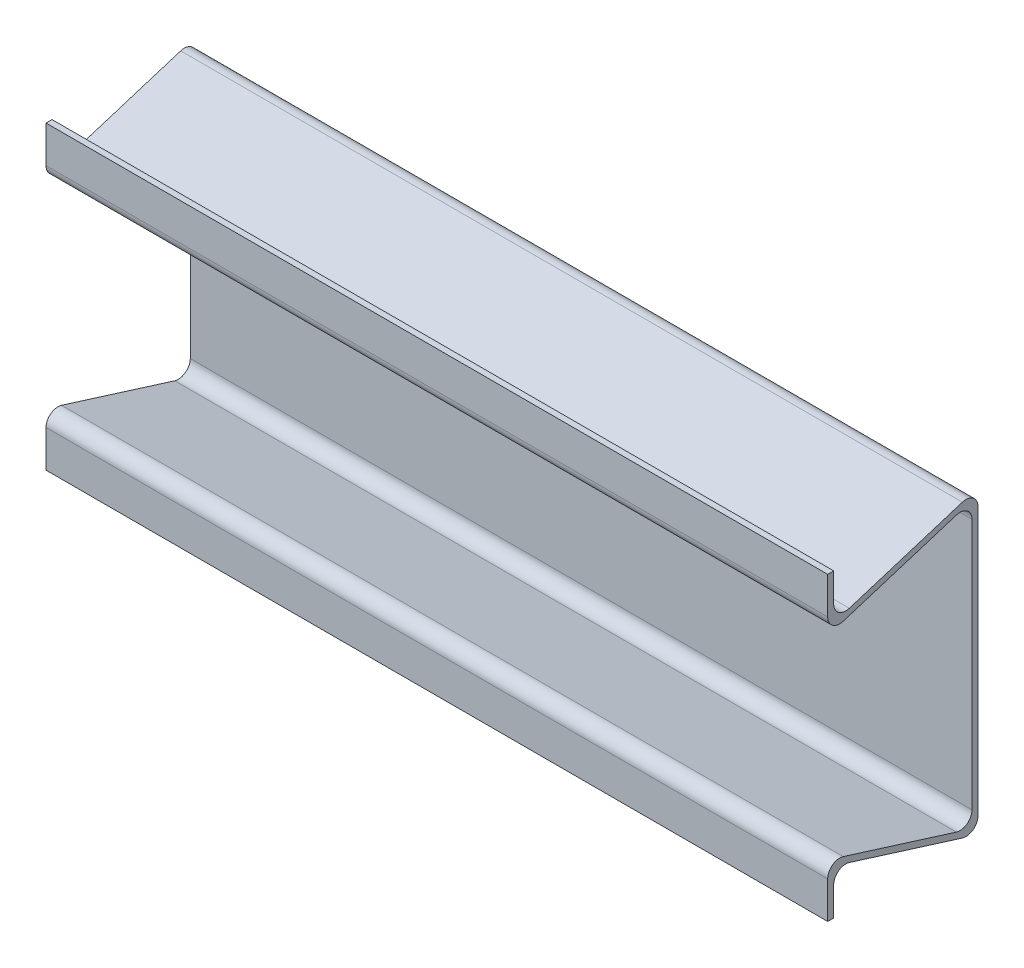
ISO-10303-21;
HEADER;
FILE_DESCRIPTION(('STEP AP214'),'2;1');
FILE_NAME('part.step','',(''),(''),'','','');
FILE_SCHEMA(('AUTOMOTIVE_DESIGN { 1 0 10303 214 1 1 1 1 }'));
ENDSEC;
DATA;
#1=APPLICATION_CONTEXT('core data for automotive mechanical design processes');
#2=APPLICATION_PROTOCOL_DEFINITION('international standard','automotive_design',2000,#1);
#3=PRODUCT_CONTEXT('',#1,'mechanical');
#4=PRODUCT('Part','Part','',(#3));
#5=PRODUCT_RELATED_PRODUCT_CATEGORY('part','',(#4));
#6=PRODUCT_DEFINITION_FORMATION('','',#4);
#7=PRODUCT_DEFINITION_CONTEXT('part definition',#1,'design');
#8=PRODUCT_DEFINITION('design','',#6,#7);
#9=PRODUCT_DEFINITION_SHAPE('','',#8);
#10=(LENGTH_UNIT() NAMED_UNIT(*) SI_UNIT(.MILLI.,.METRE.));
#11=(NAMED_UNIT(*) PLANE_ANGLE_UNIT() SI_UNIT($,.RADIAN.));
#12=(NAMED_UNIT(*) SI_UNIT($,.STERADIAN.) SOLID_ANGLE_UNIT());
#13=UNCERTAINTY_MEASURE_WITH_UNIT(LENGTH_MEASURE(1.E-05),#10,'distance_accuracy_value','');
#14=(GEOMETRIC_REPRESENTATION_CONTEXT(3) GLOBAL_UNCERTAINTY_ASSIGNED_CONTEXT((#13)) GLOBAL_UNIT_ASSIGNED_CONTEXT((#10,
#11,#12)) REPRESENTATION_CONTEXT('',''));
#15=CARTESIAN_POINT('',(0.,0.,0.));
#16=DIRECTION('',(0.,0.,1.));
#17=DIRECTION('',(1.,0.,0.));
#18=AXIS2_PLACEMENT_3D('',#15,#16,#17);
#19=CARTESIAN_POINT('',(-130.,-50.,-50.));
#20=DIRECTION('',(0.,0.,-1.));
#21=DIRECTION('',(0.,1.,0.));
#22=AXIS2_PLACEMENT_3D('',#19,#20,#21);
#23=PLANE('',#22);
#24=DIRECTION('',(0.,1.,0.));
#25=VECTOR('',#24,1.);
#26=CARTESIAN_POINT('',(130.,50.,-50.));
#27=LINE('',#26,#25);
#28=CARTESIAN_POINT('',(130.,-44.5592363464399,-50.));
#29=VERTEX_POINT('',#28);
#30=CARTESIAN_POINT('',(130.,44.55923634644,-50.));
#31=VERTEX_POINT('',#30);
#32=EDGE_CURVE('E399',#29,#31,#27,.T.);
#33=ORIENTED_EDGE('',*,*,#32,.F.);
#34=DIRECTION('',(1.,0.,0.));
#35=VECTOR('',#34,1.);
#36=CARTESIAN_POINT('',(-130.,-44.55923634644,-50.));
#37=LINE('',#36,#35);
#38=CARTESIAN_POINT('',(-130.,-44.5592363464399,-50.));
#39=VERTEX_POINT('',#38);
#40=EDGE_CURVE('E313',#29,#39,#37,.F.);
#41=ORIENTED_EDGE('',*,*,#40,.T.);
#42=DIRECTION('',(0.,1.,0.));
#43=VECTOR('',#42,1.);
#44=CARTESIAN_POINT('',(-130.,50.,-50.));
#45=LINE('',#44,#43);
#46=CARTESIAN_POINT('',(-130.,44.55923634644,-50.));
#47=VERTEX_POINT('',#46);
#48=EDGE_CURVE('E238',#39,#47,#45,.T.);
#49=ORIENTED_EDGE('',*,*,#48,.T.);
#50=DIRECTION('',(1.,0.,0.));
#51=VECTOR('',#50,1.);
#52=CARTESIAN_POINT('',(-130.,44.55923634644,-50.));
#53=LINE('',#52,#51);
#54=EDGE_CURVE('E310',#47,#31,#53,.T.);
#55=ORIENTED_EDGE('',*,*,#54,.T.);
#56=EDGE_LOOP('',(#33,#41,#49,#55));
#57=FACE_BOUND('',#56,.T.);
#58=ADVANCED_FACE('F53',(#57),#23,.T.);
#59=CARTESIAN_POINT('',(-130.,-50.,-50.));
#60=DIRECTION('',(0.,-0.95447997803503,0.298274993135947));
#61=DIRECTION('',(0.,-0.298274993135947,-0.95447997803503));
#62=AXIS2_PLACEMENT_3D('',#59,#60,#61);
#63=PLANE('',#62);
#64=DIRECTION('',(0.,-0.298274993135947,-0.95447997803503));
#65=VECTOR('',#64,1.);
#66=CARTESIAN_POINT('',(130.,-50.,-50.));
#67=LINE('',#66,#65);
#68=CARTESIAN_POINT('',(130.,-36.6228437414199,-7.19309997254378));
#69=VERTEX_POINT('',#68);
#70=CARTESIAN_POINT('',(130.,-48.3771562585801,-44.8069000274562));
#71=VERTEX_POINT('',#70);
#72=EDGE_CURVE('E235',#69,#71,#67,.T.);
#73=ORIENTED_EDGE('',*,*,#72,.F.);
#74=DIRECTION('',(1.,0.,0.));
#75=VECTOR('',#74,1.);
#76=CARTESIAN_POINT('',(-130.,-36.6228437414199,-7.19309997254379));
#77=LINE('',#76,#75);
#78=CARTESIAN_POINT('',(-130.,-36.6228437414199,-7.19309997254378));
#79=VERTEX_POINT('',#78);
#80=EDGE_CURVE('E280',#69,#79,#77,.F.);
#81=ORIENTED_EDGE('',*,*,#80,.T.);
#82=DIRECTION('',(0.,-0.298274993135947,-0.95447997803503));
#83=VECTOR('',#82,1.);
#84=CARTESIAN_POINT('',(-130.,-50.,-50.));
#85=LINE('',#84,#83);
#86=CARTESIAN_POINT('',(-130.,-48.3771562585801,-44.8069000274562));
#87=VERTEX_POINT('',#86);
#88=EDGE_CURVE('E211',#79,#87,#85,.T.);
#89=ORIENTED_EDGE('',*,*,#88,.T.);
#90=DIRECTION('',(1.,0.,0.));
#91=VECTOR('',#90,1.);
#92=CARTESIAN_POINT('',(-130.,-48.3771562585801,-44.8069000274562));
#93=LINE('',#92,#91);
#94=EDGE_CURVE('E277',#87,#71,#93,.T.);
#95=ORIENTED_EDGE('',*,*,#94,.T.);
#96=EDGE_LOOP('',(#73,#81,#89,#95));
#97=FACE_BOUND('',#96,.T.);
#98=ADVANCED_FACE('F390',(#97),#63,.T.);
#99=CARTESIAN_POINT('',(-130.,-35.,-2.));
#100=DIRECTION('',(0.,0.,-1.));
#101=DIRECTION('',(0.,1.,0.));
#102=AXIS2_PLACEMENT_3D('',#99,#100,#101);
#103=PLANE('',#102);
#104=DIRECTION('',(0.,1.,0.));
#105=VECTOR('',#104,1.);
#106=CARTESIAN_POINT('',(-130.,-35.,-2.));
#107=LINE('',#106,#105);
#108=CARTESIAN_POINT('',(-130.,-50.,-2.));
#109=VERTEX_POINT('',#108);
#110=CARTESIAN_POINT('',(-130.,-40.44076365356,-2.));
#111=VERTEX_POINT('',#110);
#112=EDGE_CURVE('E263',#109,#111,#107,.T.);
#113=ORIENTED_EDGE('',*,*,#112,.T.);
#114=DIRECTION('',(1.,0.,0.));
#115=VECTOR('',#114,1.);
#116=CARTESIAN_POINT('',(130.,-40.44076365356,-2.));
#117=LINE('',#116,#115);
#118=CARTESIAN_POINT('',(130.,-40.44076365356,-2.));
#119=VERTEX_POINT('',#118);
#120=EDGE_CURVE('E270',#111,#119,#117,.T.);
#121=ORIENTED_EDGE('',*,*,#120,.T.);
#122=DIRECTION('',(0.,1.,0.));
#123=VECTOR('',#122,1.);
#124=CARTESIAN_POINT('',(130.,-35.,-2.));
#125=LINE('',#124,#123);
#126=CARTESIAN_POINT('',(130.,-50.,-2.));
#127=VERTEX_POINT('',#126);
#128=EDGE_CURVE('E232',#127,#119,#125,.T.);
#129=ORIENTED_EDGE('',*,*,#128,.F.);
#130=DIRECTION('',(1.,0.,0.));
#131=VECTOR('',#130,1.);
#132=CARTESIAN_POINT('',(-130.,-50.,-2.));
#133=LINE('',#132,#131);
#134=EDGE_CURVE('E268',#109,#127,#133,.T.);
#135=ORIENTED_EDGE('',*,*,#134,.F.);
#136=EDGE_LOOP('',(#113,#121,#129,#135));
#137=FACE_BOUND('',#136,.T.);
#138=ADVANCED_FACE('F381',(#137),#103,.T.);
#139=CARTESIAN_POINT('',(-130.,-50.,0.));
#140=DIRECTION('',(0.,-1.,0.));
#141=DIRECTION('',(0.,0.,-1.));
#142=AXIS2_PLACEMENT_3D('',#139,#140,#141);
#143=PLANE('',#142);
#144=ORIENTED_EDGE('',*,*,#134,.T.);
#145=DIRECTION('',(0.,0.,-1.));
#146=VECTOR('',#145,1.);
#147=CARTESIAN_POINT('',(130.,-50.,0.));
#148=LINE('',#147,#146);
#149=CARTESIAN_POINT('',(130.,-50.,0.));
#150=VERTEX_POINT('',#149);
#151=EDGE_CURVE('E229',#150,#127,#148,.T.);
#152=ORIENTED_EDGE('',*,*,#151,.F.);
#153=DIRECTION('',(1.,0.,0.));
#154=VECTOR('',#153,1.);
#155=CARTESIAN_POINT('',(-130.,-50.,0.));
#156=LINE('',#155,#154);
#157=CARTESIAN_POINT('',(-130.,-50.,0.));
#158=VERTEX_POINT('',#157);
#159=EDGE_CURVE('E271',#158,#150,#156,.T.);
#160=ORIENTED_EDGE('',*,*,#159,.F.);
#161=DIRECTION('',(0.,0.,-1.));
#162=VECTOR('',#161,1.);
#163=CARTESIAN_POINT('',(-130.,-50.,0.));
#164=LINE('',#163,#162);
#165=EDGE_CURVE('E260',#158,#109,#164,.T.);
#166=ORIENTED_EDGE('',*,*,#165,.T.);
#167=EDGE_LOOP('',(#144,#152,#160,#166));
#168=FACE_BOUND('',#167,.T.);
#169=ADVANCED_FACE('F378',(#168),#143,.T.);
#170=CARTESIAN_POINT('',(-130.,-32.27961817322,0.));
#171=DIRECTION('',(0.,0.,1.));
#172=DIRECTION('',(1.,0.,0.));
#173=AXIS2_PLACEMENT_3D('',#170,#171,#172);
#174=PLANE('',#173);
#175=DIRECTION('',(0.,-1.,0.));
#176=VECTOR('',#175,1.);
#177=CARTESIAN_POINT('',(130.,-32.27961817322,0.));
#178=LINE('',#177,#176);
#179=CARTESIAN_POINT('',(130.,-37.72038182678,0.));
#180=VERTEX_POINT('',#179);
#181=EDGE_CURVE('E227',#180,#150,#178,.T.);
#182=ORIENTED_EDGE('',*,*,#181,.F.);
#183=DIRECTION('',(1.,0.,0.));
#184=VECTOR('',#183,1.);
#185=CARTESIAN_POINT('',(-130.,-37.72038182678,0.));
#186=LINE('',#185,#184);
#187=CARTESIAN_POINT('',(-130.,-37.72038182678,0.));
#188=VERTEX_POINT('',#187);
#189=EDGE_CURVE('E295',#180,#188,#186,.F.);
#190=ORIENTED_EDGE('',*,*,#189,.T.);
#191=DIRECTION('',(0.,-1.,0.));
#192=VECTOR('',#191,1.);
#193=CARTESIAN_POINT('',(-130.,-32.27961817322,0.));
#194=LINE('',#193,#192);
#195=EDGE_CURVE('E258',#188,#158,#194,.T.);
#196=ORIENTED_EDGE('',*,*,#195,.T.);
#197=ORIENTED_EDGE('',*,*,#159,.T.);
#198=EDGE_LOOP('',(#182,#190,#196,#197));
#199=FACE_BOUND('',#198,.T.);
#200=ADVANCED_FACE('F373',(#199),#174,.T.);
#201=CARTESIAN_POINT('',(-130.,-47.27961817322,-48.));
#202=DIRECTION('',(0.,0.95447997803503,-0.298274993135947));
#203=DIRECTION('',(0.,0.298274993135947,0.95447997803503));
#204=AXIS2_PLACEMENT_3D('',#201,#202,#203);
#205=PLANE('',#204);
#206=DIRECTION('',(0.,0.298274993135947,0.95447997803503));
#207=VECTOR('',#206,1.);
#208=CARTESIAN_POINT('',(-130.,-47.27961817322,-48.));
#209=LINE('',#208,#207);
#210=CARTESIAN_POINT('',(-130.,-45.6567744318,-42.8069000274562));
#211=VERTEX_POINT('',#210);
#212=CARTESIAN_POINT('',(-130.,-33.9024619146399,-5.19309997254379));
#213=VERTEX_POINT('',#212);
#214=EDGE_CURVE('E255',#211,#213,#209,.T.);
#215=ORIENTED_EDGE('',*,*,#214,.T.);
#216=DIRECTION('',(1.,0.,0.));
#217=VECTOR('',#216,1.);
#218=CARTESIAN_POINT('',(-130.,-33.9024619146399,-5.19309997254379));
#219=LINE('',#218,#217);
#220=CARTESIAN_POINT('',(130.,-33.9024619146399,-5.19309997254379));
#221=VERTEX_POINT('',#220);
#222=EDGE_CURVE('E284',#213,#221,#219,.T.);
#223=ORIENTED_EDGE('',*,*,#222,.T.);
#224=DIRECTION('',(0.,0.298274993135947,0.95447997803503));
#225=VECTOR('',#224,1.);
#226=CARTESIAN_POINT('',(130.,-47.27961817322,-48.));
#227=LINE('',#226,#225);
#228=CARTESIAN_POINT('',(130.,-45.6567744318,-42.8069000274562));
#229=VERTEX_POINT('',#228);
#230=EDGE_CURVE('E225',#229,#221,#227,.T.);
#231=ORIENTED_EDGE('',*,*,#230,.F.);
#232=DIRECTION('',(1.,0.,0.));
#233=VECTOR('',#232,1.);
#234=CARTESIAN_POINT('',(-130.,-45.6567744318,-42.8069000274562));
#235=LINE('',#234,#233);
#236=EDGE_CURVE('E282',#229,#211,#235,.F.);
#237=ORIENTED_EDGE('',*,*,#236,.T.);
#238=EDGE_LOOP('',(#215,#223,#231,#237));
#239=FACE_BOUND('',#238,.T.);
#240=ADVANCED_FACE('F364',(#239),#205,.T.);
#241=CARTESIAN_POINT('',(-130.,-47.27961817322,-48.));
#242=DIRECTION('',(0.,0.,1.));
#243=DIRECTION('',(0.,-1.,0.));
#244=AXIS2_PLACEMENT_3D('',#241,#242,#243);
#245=PLANE('',#244);
#246=DIRECTION('',(0.,-1.,0.));
#247=VECTOR('',#246,1.);
#248=CARTESIAN_POINT('',(-130.,47.27961817322,-48.));
#249=LINE('',#248,#247);
#250=CARTESIAN_POINT('',(-130.,41.8388545196599,-48.));
#251=VERTEX_POINT('',#250);
#252=CARTESIAN_POINT('',(-130.,-41.8388545196599,-48.));
#253=VERTEX_POINT('',#252);
#254=EDGE_CURVE('E252',#251,#253,#249,.T.);
#255=ORIENTED_EDGE('',*,*,#254,.T.);
#256=DIRECTION('',(1.,0.,0.));
#257=VECTOR('',#256,1.);
#258=CARTESIAN_POINT('',(130.,-41.8388545196599,-48.));
#259=LINE('',#258,#257);
#260=CARTESIAN_POINT('',(130.,-41.8388545196599,-48.));
#261=VERTEX_POINT('',#260);
#262=EDGE_CURVE('E307',#253,#261,#259,.T.);
#263=ORIENTED_EDGE('',*,*,#262,.T.);
#264=DIRECTION('',(0.,-1.,0.));
#265=VECTOR('',#264,1.);
#266=CARTESIAN_POINT('',(130.,47.27961817322,-48.));
#267=LINE('',#266,#265);
#268=CARTESIAN_POINT('',(130.,41.8388545196599,-48.));
#269=VERTEX_POINT('',#268);
#270=EDGE_CURVE('E222',#269,#261,#267,.T.);
#271=ORIENTED_EDGE('',*,*,#270,.F.);
#272=DIRECTION('',(1.,0.,0.));
#273=VECTOR('',#272,1.);
#274=CARTESIAN_POINT('',(-130.,41.8388545196599,-48.));
#275=LINE('',#274,#273);
#276=EDGE_CURVE('E305',#269,#251,#275,.F.);
#277=ORIENTED_EDGE('',*,*,#276,.T.);
#278=EDGE_LOOP('',(#255,#263,#271,#277));
#279=FACE_BOUND('',#278,.T.);
#280=ADVANCED_FACE('F356',(#279),#245,.T.);
#281=CARTESIAN_POINT('',(-130.,47.27961817322,-48.));
#282=DIRECTION('',(0.,-0.95447997803503,-0.298274993135947));
#283=DIRECTION('',(0.,0.298274993135947,-0.95447997803503));
#284=AXIS2_PLACEMENT_3D('',#281,#282,#283);
#285=PLANE('',#284);
#286=DIRECTION('',(0.,0.298274993135947,-0.95447997803503));
#287=VECTOR('',#286,1.);
#288=CARTESIAN_POINT('',(-130.,47.27961817322,-48.));
#289=LINE('',#288,#287);
#290=CARTESIAN_POINT('',(-130.,33.9024619146399,-5.19309997254379));
#291=VERTEX_POINT('',#290);
#292=CARTESIAN_POINT('',(-130.,45.6567744318001,-42.8069000274562));
#293=VERTEX_POINT('',#292);
#294=EDGE_CURVE('E249',#291,#293,#289,.T.);
#295=ORIENTED_EDGE('',*,*,#294,.T.);
#296=DIRECTION('',(1.,0.,0.));
#297=VECTOR('',#296,1.);
#298=CARTESIAN_POINT('',(130.,45.6567744318001,-42.8069000274562));
#299=LINE('',#298,#297);
#300=CARTESIAN_POINT('',(130.,45.6567744318001,-42.8069000274562));
#301=VERTEX_POINT('',#300);
#302=EDGE_CURVE('E321',#293,#301,#299,.T.);
#303=ORIENTED_EDGE('',*,*,#302,.T.);
#304=DIRECTION('',(0.,0.298274993135947,-0.95447997803503));
#305=VECTOR('',#304,1.);
#306=CARTESIAN_POINT('',(130.,47.27961817322,-48.));
#307=LINE('',#306,#305);
#308=CARTESIAN_POINT('',(130.,33.9024619146399,-5.19309997254379));
#309=VERTEX_POINT('',#308);
#310=EDGE_CURVE('E216',#309,#301,#307,.T.);
#311=ORIENTED_EDGE('',*,*,#310,.F.);
#312=DIRECTION('',(1.,0.,0.));
#313=VECTOR('',#312,1.);
#314=CARTESIAN_POINT('',(-130.,33.9024619146399,-5.19309997254379));
#315=LINE('',#314,#313);
#316=EDGE_CURVE('E319',#309,#291,#315,.F.);
#317=ORIENTED_EDGE('',*,*,#316,.T.);
#318=EDGE_LOOP('',(#295,#303,#311,#317));
#319=FACE_BOUND('',#318,.T.);
#320=ADVANCED_FACE('F350',(#319),#285,.T.);
#321=CARTESIAN_POINT('',(-130.,32.27961817322,0.));
#322=DIRECTION('',(0.,0.,1.));
#323=DIRECTION('',(1.,0.,0.));
#324=AXIS2_PLACEMENT_3D('',#321,#322,#323);
#325=PLANE('',#324);
#326=DIRECTION('',(0.,-1.,0.));
#327=VECTOR('',#326,1.);
#328=CARTESIAN_POINT('',(-130.,32.27961817322,0.));
#329=LINE('',#328,#327);
#330=CARTESIAN_POINT('',(-130.,50.,0.));
#331=VERTEX_POINT('',#330);
#332=CARTESIAN_POINT('',(-130.,37.72038182678,0.));
#333=VERTEX_POINT('',#332);
#334=EDGE_CURVE('E246',#331,#333,#329,.T.);
#335=ORIENTED_EDGE('',*,*,#334,.T.);
#336=DIRECTION('',(1.,0.,0.));
#337=VECTOR('',#336,1.);
#338=CARTESIAN_POINT('',(-130.,37.72038182678,0.));
#339=LINE('',#338,#337);
#340=CARTESIAN_POINT('',(130.,37.72038182678,0.));
#341=VERTEX_POINT('',#340);
#342=EDGE_CURVE('E326',#333,#341,#339,.T.);
#343=ORIENTED_EDGE('',*,*,#342,.T.);
#344=DIRECTION('',(0.,-1.,0.));
#345=VECTOR('',#344,1.);
#346=CARTESIAN_POINT('',(130.,32.27961817322,0.));
#347=LINE('',#346,#345);
#348=CARTESIAN_POINT('',(130.,50.,0.));
#349=VERTEX_POINT('',#348);
#350=EDGE_CURVE('E214',#349,#341,#347,.T.);
#351=ORIENTED_EDGE('',*,*,#350,.F.);
#352=DIRECTION('',(1.,0.,0.));
#353=VECTOR('',#352,1.);
#354=CARTESIAN_POINT('',(-130.,50.,0.));
#355=LINE('',#354,#353);
#356=EDGE_CURVE('E210',#331,#349,#355,.T.);
#357=ORIENTED_EDGE('',*,*,#356,.F.);
#358=EDGE_LOOP('',(#335,#343,#351,#357));
#359=FACE_BOUND('',#358,.T.);
#360=ADVANCED_FACE('F414',(#359),#325,.T.);
#361=CARTESIAN_POINT('',(-130.,50.,0.));
#362=DIRECTION('',(0.,1.,0.));
#363=DIRECTION('',(0.,0.,1.));
#364=AXIS2_PLACEMENT_3D('',#361,#362,#363);
#365=PLANE('',#364);
#366=ORIENTED_EDGE('',*,*,#356,.T.);
#367=DIRECTION('',(0.,0.,1.));
#368=VECTOR('',#367,1.);
#369=CARTESIAN_POINT('',(130.,50.,0.));
#370=LINE('',#369,#368);
#371=CARTESIAN_POINT('',(130.,50.,-2.));
#372=VERTEX_POINT('',#371);
#373=EDGE_CURVE('E196',#372,#349,#370,.T.);
#374=ORIENTED_EDGE('',*,*,#373,.F.);
#375=DIRECTION('',(1.,0.,0.));
#376=VECTOR('',#375,1.);
#377=CARTESIAN_POINT('',(-130.,50.,-2.));
#378=LINE('',#377,#376);
#379=CARTESIAN_POINT('',(-130.,50.,-2.));
#380=VERTEX_POINT('',#379);
#381=EDGE_CURVE('E204',#380,#372,#378,.T.);
#382=ORIENTED_EDGE('',*,*,#381,.F.);
#383=DIRECTION('',(0.,0.,1.));
#384=VECTOR('',#383,1.);
#385=CARTESIAN_POINT('',(-130.,50.,0.));
#386=LINE('',#385,#384);
#387=EDGE_CURVE('E244',#380,#331,#386,.T.);
#388=ORIENTED_EDGE('',*,*,#387,.T.);
#389=EDGE_LOOP('',(#366,#374,#382,#388));
#390=FACE_BOUND('',#389,.T.);
#391=ADVANCED_FACE('F213',(#390),#365,.T.);
#392=CARTESIAN_POINT('',(-130.,35.,-2.));
#393=DIRECTION('',(0.,0.,-1.));
#394=DIRECTION('',(0.,1.,0.));
#395=AXIS2_PLACEMENT_3D('',#392,#393,#394);
#396=PLANE('',#395);
#397=DIRECTION('',(0.,1.,0.));
#398=VECTOR('',#397,1.);
#399=CARTESIAN_POINT('',(130.,35.,-2.));
#400=LINE('',#399,#398);
#401=CARTESIAN_POINT('',(130.,40.44076365356,-2.));
#402=VERTEX_POINT('',#401);
#403=EDGE_CURVE('E190',#402,#372,#400,.T.);
#404=ORIENTED_EDGE('',*,*,#403,.F.);
#405=DIRECTION('',(1.,0.,0.));
#406=VECTOR('',#405,1.);
#407=CARTESIAN_POINT('',(-130.,40.44076365356,-2.));
#408=LINE('',#407,#406);
#409=CARTESIAN_POINT('',(-130.,40.44076365356,-2.));
#410=VERTEX_POINT('',#409);
#411=EDGE_CURVE('E324',#402,#410,#408,.F.);
#412=ORIENTED_EDGE('',*,*,#411,.T.);
#413=DIRECTION('',(0.,1.,0.));
#414=VECTOR('',#413,1.);
#415=CARTESIAN_POINT('',(-130.,35.,-2.));
#416=LINE('',#415,#414);
#417=EDGE_CURVE('E206',#410,#380,#416,.T.);
#418=ORIENTED_EDGE('',*,*,#417,.T.);
#419=ORIENTED_EDGE('',*,*,#381,.T.);
#420=EDGE_LOOP('',(#404,#412,#418,#419));
#421=FACE_BOUND('',#420,.T.);
#422=ADVANCED_FACE('F205',(#421),#396,.T.);
#423=CARTESIAN_POINT('',(-130.,50.,-50.));
#424=DIRECTION('',(0.,0.95447997803503,0.298274993135947));
#425=DIRECTION('',(0.,-0.298274993135947,0.95447997803503));
#426=AXIS2_PLACEMENT_3D('',#423,#424,#425);
#427=PLANE('',#426);
#428=DIRECTION('',(0.,-0.298274993135947,0.95447997803503));
#429=VECTOR('',#428,1.);
#430=CARTESIAN_POINT('',(130.,50.,-50.));
#431=LINE('',#430,#429);
#432=CARTESIAN_POINT('',(130.,48.3771562585801,-44.8069000274562));
#433=VERTEX_POINT('',#432);
#434=CARTESIAN_POINT('',(130.,36.6228437414199,-7.19309997254378));
#435=VERTEX_POINT('',#434);
#436=EDGE_CURVE('E201',#433,#435,#431,.T.);
#437=ORIENTED_EDGE('',*,*,#436,.F.);
#438=DIRECTION('',(1.,0.,0.));
#439=VECTOR('',#438,1.);
#440=CARTESIAN_POINT('',(-130.,48.3771562585801,-44.8069000274562));
#441=LINE('',#440,#439);
#442=CARTESIAN_POINT('',(-130.,48.3771562585801,-44.8069000274562));
#443=VERTEX_POINT('',#442);
#444=EDGE_CURVE('E73',#433,#443,#441,.F.);
#445=ORIENTED_EDGE('',*,*,#444,.T.);
#446=DIRECTION('',(0.,-0.298274993135947,0.95447997803503));
#447=VECTOR('',#446,1.);
#448=CARTESIAN_POINT('',(-130.,50.,-50.));
#449=LINE('',#448,#447);
#450=CARTESIAN_POINT('',(-130.,36.6228437414199,-7.19309997254378));
#451=VERTEX_POINT('',#450);
#452=EDGE_CURVE('E241',#443,#451,#449,.T.);
#453=ORIENTED_EDGE('',*,*,#452,.T.);
#454=DIRECTION('',(1.,0.,0.));
#455=VECTOR('',#454,1.);
#456=CARTESIAN_POINT('',(130.,36.6228437414199,-7.19309997254378));
#457=LINE('',#456,#455);
#458=EDGE_CURVE('E315',#451,#435,#457,.T.);
#459=ORIENTED_EDGE('',*,*,#458,.T.);
#460=EDGE_LOOP('',(#437,#445,#453,#459));
#461=FACE_BOUND('',#460,.T.);
#462=ADVANCED_FACE('F404',(#461),#427,.T.);
#463=CARTESIAN_POINT('',(-130.,0.,0.));
#464=DIRECTION('',(1.,0.,0.));
#465=DIRECTION('',(0.,0.,-1.));
#466=AXIS2_PLACEMENT_3D('',#463,#464,#465);
#467=PLANE('',#466);
#468=ORIENTED_EDGE('',*,*,#195,.F.);
#469=CARTESIAN_POINT('',(-130.,-37.72038182678,-4.));
#470=DIRECTION('',(1.,0.,0.));
#471=DIRECTION('',(0.,0.,-1.));
#472=AXIS2_PLACEMENT_3D('',#469,#470,#471);
#473=CIRCLE('',#472,4.);
#474=EDGE_CURVE('E303',#188,#213,#473,.F.);
#475=ORIENTED_EDGE('',*,*,#474,.T.);
#476=ORIENTED_EDGE('',*,*,#214,.F.);
#477=CARTESIAN_POINT('',(-130.,-41.8388545196599,-44.));
#478=DIRECTION('',(1.,0.,0.));
#479=DIRECTION('',(0.,0.,-1.));
#480=AXIS2_PLACEMENT_3D('',#477,#478,#479);
#481=CIRCLE('',#480,4.);
#482=EDGE_CURVE('E335',#211,#253,#481,.T.);
#483=ORIENTED_EDGE('',*,*,#482,.T.);
#484=ORIENTED_EDGE('',*,*,#254,.F.);
#485=CARTESIAN_POINT('',(-130.,41.8388545196599,-44.));
#486=DIRECTION('',(1.,0.,0.));
#487=DIRECTION('',(0.,0.,-1.));
#488=AXIS2_PLACEMENT_3D('',#485,#486,#487);
#489=CIRCLE('',#488,4.);
#490=EDGE_CURVE('E339',#251,#293,#489,.T.);
#491=ORIENTED_EDGE('',*,*,#490,.T.);
#492=ORIENTED_EDGE('',*,*,#294,.F.);
#493=CARTESIAN_POINT('',(-130.,37.72038182678,-4.));
#494=DIRECTION('',(1.,0.,0.));
#495=DIRECTION('',(0.,0.,-1.));
#496=AXIS2_PLACEMENT_3D('',#493,#494,#495);
#497=CIRCLE('',#496,4.);
#498=EDGE_CURVE('E297',#291,#333,#497,.F.);
#499=ORIENTED_EDGE('',*,*,#498,.T.);
#500=ORIENTED_EDGE('',*,*,#334,.F.);
#501=ORIENTED_EDGE('',*,*,#387,.F.);
#502=ORIENTED_EDGE('',*,*,#417,.F.);
#503=CARTESIAN_POINT('',(-130.,40.44076365356,-6.));
#504=DIRECTION('',(1.,0.,0.));
#505=DIRECTION('',(0.,0.,-1.));
#506=AXIS2_PLACEMENT_3D('',#503,#504,#505);
#507=CIRCLE('',#506,4.);
#508=EDGE_CURVE('E13',#410,#451,#507,.T.);
#509=ORIENTED_EDGE('',*,*,#508,.T.);
#510=ORIENTED_EDGE('',*,*,#452,.F.);
#511=CARTESIAN_POINT('',(-130.,44.55923634644,-46.));
#512=DIRECTION('',(1.,0.,0.));
#513=DIRECTION('',(0.,0.,-1.));
#514=AXIS2_PLACEMENT_3D('',#511,#512,#513);
#515=CIRCLE('',#514,4.);
#516=EDGE_CURVE('E299',#443,#47,#515,.F.);
#517=ORIENTED_EDGE('',*,*,#516,.T.);
#518=ORIENTED_EDGE('',*,*,#48,.F.);
#519=CARTESIAN_POINT('',(-130.,-44.55923634644,-46.));
#520=DIRECTION('',(1.,0.,0.));
#521=DIRECTION('',(0.,0.,-1.));
#522=AXIS2_PLACEMENT_3D('',#519,#520,#521);
#523=CIRCLE('',#522,4.);
#524=EDGE_CURVE('E301',#39,#87,#523,.F.);
#525=ORIENTED_EDGE('',*,*,#524,.T.);
#526=ORIENTED_EDGE('',*,*,#88,.F.);
#527=CARTESIAN_POINT('',(-130.,-40.44076365356,-6.));
#528=DIRECTION('',(1.,0.,0.));
#529=DIRECTION('',(0.,0.,-1.));
#530=AXIS2_PLACEMENT_3D('',#527,#528,#529);
#531=CIRCLE('',#530,4.);
#532=EDGE_CURVE('E331',#79,#111,#531,.T.);
#533=ORIENTED_EDGE('',*,*,#532,.T.);
#534=ORIENTED_EDGE('',*,*,#112,.F.);
#535=ORIENTED_EDGE('',*,*,#165,.F.);
#536=EDGE_LOOP('',(#468,#475,#476,#483,#484,#491,#492,#499,#500,#501,#502,#509,#510,#517,#518,
#525,#526,#533,#534,#535));
#537=FACE_BOUND('',#536,.T.);
#538=ADVANCED_FACE('F344',(#537),#467,.F.);
#539=CARTESIAN_POINT('',(130.,0.,0.));
#540=DIRECTION('',(1.,0.,0.));
#541=DIRECTION('',(0.,0.,-1.));
#542=AXIS2_PLACEMENT_3D('',#539,#540,#541);
#543=PLANE('',#542);
#544=ORIENTED_EDGE('',*,*,#230,.T.);
#545=CARTESIAN_POINT('',(130.,-37.72038182678,-4.));
#546=DIRECTION('',(1.,0.,0.));
#547=DIRECTION('',(0.,0.,-1.));
#548=AXIS2_PLACEMENT_3D('',#545,#546,#547);
#549=CIRCLE('',#548,4.);
#550=EDGE_CURVE('E293',#221,#180,#549,.T.);
#551=ORIENTED_EDGE('',*,*,#550,.T.);
#552=ORIENTED_EDGE('',*,*,#181,.T.);
#553=ORIENTED_EDGE('',*,*,#151,.T.);
#554=ORIENTED_EDGE('',*,*,#128,.T.);
#555=CARTESIAN_POINT('',(130.,-40.44076365356,-6.));
#556=DIRECTION('',(1.,0.,0.));
#557=DIRECTION('',(0.,0.,-1.));
#558=AXIS2_PLACEMENT_3D('',#555,#556,#557);
#559=CIRCLE('',#558,4.);
#560=EDGE_CURVE('E329',#119,#69,#559,.F.);
#561=ORIENTED_EDGE('',*,*,#560,.T.);
#562=ORIENTED_EDGE('',*,*,#72,.T.);
#563=CARTESIAN_POINT('',(130.,-44.55923634644,-46.));
#564=DIRECTION('',(1.,0.,0.));
#565=DIRECTION('',(0.,0.,-1.));
#566=AXIS2_PLACEMENT_3D('',#563,#564,#565);
#567=CIRCLE('',#566,4.);
#568=EDGE_CURVE('E291',#71,#29,#567,.T.);
#569=ORIENTED_EDGE('',*,*,#568,.T.);
#570=ORIENTED_EDGE('',*,*,#32,.T.);
#571=CARTESIAN_POINT('',(130.,44.55923634644,-46.));
#572=DIRECTION('',(1.,0.,0.));
#573=DIRECTION('',(0.,0.,-1.));
#574=AXIS2_PLACEMENT_3D('',#571,#572,#573);
#575=CIRCLE('',#574,4.);
#576=EDGE_CURVE('E289',#31,#433,#575,.T.);
#577=ORIENTED_EDGE('',*,*,#576,.T.);
#578=ORIENTED_EDGE('',*,*,#436,.T.);
#579=CARTESIAN_POINT('',(130.,40.44076365356,-6.));
#580=DIRECTION('',(1.,0.,0.));
#581=DIRECTION('',(0.,0.,-1.));
#582=AXIS2_PLACEMENT_3D('',#579,#580,#581);
#583=CIRCLE('',#582,4.);
#584=EDGE_CURVE('E61',#435,#402,#583,.F.);
#585=ORIENTED_EDGE('',*,*,#584,.T.);
#586=ORIENTED_EDGE('',*,*,#403,.T.);
#587=ORIENTED_EDGE('',*,*,#373,.T.);
#588=ORIENTED_EDGE('',*,*,#350,.T.);
#589=CARTESIAN_POINT('',(130.,37.72038182678,-4.));
#590=DIRECTION('',(1.,0.,0.));
#591=DIRECTION('',(0.,0.,-1.));
#592=AXIS2_PLACEMENT_3D('',#589,#590,#591);
#593=CIRCLE('',#592,4.);
#594=EDGE_CURVE('E287',#341,#309,#593,.T.);
#595=ORIENTED_EDGE('',*,*,#594,.T.);
#596=ORIENTED_EDGE('',*,*,#310,.T.);
#597=CARTESIAN_POINT('',(130.,41.8388545196599,-44.));
#598=DIRECTION('',(1.,0.,0.));
#599=DIRECTION('',(0.,0.,-1.));
#600=AXIS2_PLACEMENT_3D('',#597,#598,#599);
#601=CIRCLE('',#600,4.);
#602=EDGE_CURVE('E337',#301,#269,#601,.F.);
#603=ORIENTED_EDGE('',*,*,#602,.T.);
#604=ORIENTED_EDGE('',*,*,#270,.T.);
#605=CARTESIAN_POINT('',(130.,-41.8388545196599,-44.));
#606=DIRECTION('',(1.,0.,0.));
#607=DIRECTION('',(0.,0.,-1.));
#608=AXIS2_PLACEMENT_3D('',#605,#606,#607);
#609=CIRCLE('',#608,4.);
#610=EDGE_CURVE('E333',#261,#229,#609,.F.);
#611=ORIENTED_EDGE('',*,*,#610,.T.);
#612=EDGE_LOOP('',(#544,#551,#552,#553,#554,#561,#562,#569,#570,#577,#578,#585,#586,#587,#588,
#595,#596,#603,#604,#611));
#613=FACE_BOUND('',#612,.T.);
#614=ADVANCED_FACE('F193',(#613),#543,.T.);
#615=CARTESIAN_POINT('',(-130.,-40.44076365356,-6.));
#616=DIRECTION('',(-1.,0.,0.));
#617=DIRECTION('',(0.,0.,1.));
#618=AXIS2_PLACEMENT_3D('',#615,#616,#617);
#619=CYLINDRICAL_SURFACE('',#618,4.);
#620=ORIENTED_EDGE('',*,*,#532,.F.);
#621=ORIENTED_EDGE('',*,*,#80,.F.);
#622=ORIENTED_EDGE('',*,*,#560,.F.);
#623=ORIENTED_EDGE('',*,*,#120,.F.);
#624=EDGE_LOOP('',(#620,#621,#622,#623));
#625=FACE_BOUND('',#624,.T.);
#626=ADVANCED_FACE('F386',(#625),#619,.F.);
#627=CARTESIAN_POINT('',(-130.,-37.72038182678,-4.));
#628=DIRECTION('',(1.,0.,0.));
#629=DIRECTION('',(0.,0.,-1.));
#630=AXIS2_PLACEMENT_3D('',#627,#628,#629);
#631=CYLINDRICAL_SURFACE('',#630,4.);
#632=ORIENTED_EDGE('',*,*,#474,.F.);
#633=ORIENTED_EDGE('',*,*,#189,.F.);
#634=ORIENTED_EDGE('',*,*,#550,.F.);
#635=ORIENTED_EDGE('',*,*,#222,.F.);
#636=EDGE_LOOP('',(#632,#633,#634,#635));
#637=FACE_BOUND('',#636,.T.);
#638=ADVANCED_FACE('F369',(#637),#631,.T.);
#639=CARTESIAN_POINT('',(-130.,-41.8388545196599,-44.));
#640=DIRECTION('',(-1.,0.,0.));
#641=DIRECTION('',(0.,0.,1.));
#642=AXIS2_PLACEMENT_3D('',#639,#640,#641);
#643=CYLINDRICAL_SURFACE('',#642,4.);
#644=ORIENTED_EDGE('',*,*,#482,.F.);
#645=ORIENTED_EDGE('',*,*,#236,.F.);
#646=ORIENTED_EDGE('',*,*,#610,.F.);
#647=ORIENTED_EDGE('',*,*,#262,.F.);
#648=EDGE_LOOP('',(#644,#645,#646,#647));
#649=FACE_BOUND('',#648,.T.);
#650=ADVANCED_FACE('F360',(#649),#643,.F.);
#651=CARTESIAN_POINT('',(-130.,-44.55923634644,-46.));
#652=DIRECTION('',(1.,0.,0.));
#653=DIRECTION('',(0.,0.,-1.));
#654=AXIS2_PLACEMENT_3D('',#651,#652,#653);
#655=CYLINDRICAL_SURFACE('',#654,4.);
#656=ORIENTED_EDGE('',*,*,#524,.F.);
#657=ORIENTED_EDGE('',*,*,#40,.F.);
#658=ORIENTED_EDGE('',*,*,#568,.F.);
#659=ORIENTED_EDGE('',*,*,#94,.F.);
#660=EDGE_LOOP('',(#656,#657,#658,#659));
#661=FACE_BOUND('',#660,.T.);
#662=ADVANCED_FACE('F395',(#661),#655,.T.);
#663=CARTESIAN_POINT('',(-130.,44.55923634644,-46.));
#664=DIRECTION('',(1.,0.,0.));
#665=DIRECTION('',(0.,0.,-1.));
#666=AXIS2_PLACEMENT_3D('',#663,#664,#665);
#667=CYLINDRICAL_SURFACE('',#666,4.);
#668=ORIENTED_EDGE('',*,*,#516,.F.);
#669=ORIENTED_EDGE('',*,*,#444,.F.);
#670=ORIENTED_EDGE('',*,*,#576,.F.);
#671=ORIENTED_EDGE('',*,*,#54,.F.);
#672=EDGE_LOOP('',(#668,#669,#670,#671));
#673=FACE_BOUND('',#672,.T.);
#674=ADVANCED_FACE('F408',(#673),#667,.T.);
#675=CARTESIAN_POINT('',(-130.,41.8388545196599,-44.));
#676=DIRECTION('',(-1.,0.,0.));
#677=DIRECTION('',(0.,0.,1.));
#678=AXIS2_PLACEMENT_3D('',#675,#676,#677);
#679=CYLINDRICAL_SURFACE('',#678,4.);
#680=ORIENTED_EDGE('',*,*,#490,.F.);
#681=ORIENTED_EDGE('',*,*,#276,.F.);
#682=ORIENTED_EDGE('',*,*,#602,.F.);
#683=ORIENTED_EDGE('',*,*,#302,.F.);
#684=EDGE_LOOP('',(#680,#681,#682,#683));
#685=FACE_BOUND('',#684,.T.);
#686=ADVANCED_FACE('F353',(#685),#679,.F.);
#687=CARTESIAN_POINT('',(-130.,40.44076365356,-6.));
#688=DIRECTION('',(-1.,0.,0.));
#689=DIRECTION('',(0.,0.,1.));
#690=AXIS2_PLACEMENT_3D('',#687,#688,#689);
#691=CYLINDRICAL_SURFACE('',#690,4.);
#692=ORIENTED_EDGE('',*,*,#508,.F.);
#693=ORIENTED_EDGE('',*,*,#411,.F.);
#694=ORIENTED_EDGE('',*,*,#584,.F.);
#695=ORIENTED_EDGE('',*,*,#458,.F.);
#696=EDGE_LOOP('',(#692,#693,#694,#695));
#697=FACE_BOUND('',#696,.T.);
#698=ADVANCED_FACE('F410',(#697),#691,.F.);
#699=CARTESIAN_POINT('',(-130.,37.72038182678,-4.));
#700=DIRECTION('',(1.,0.,0.));
#701=DIRECTION('',(0.,0.,-1.));
#702=AXIS2_PLACEMENT_3D('',#699,#700,#701);
#703=CYLINDRICAL_SURFACE('',#702,4.);
#704=ORIENTED_EDGE('',*,*,#498,.F.);
#705=ORIENTED_EDGE('',*,*,#316,.F.);
#706=ORIENTED_EDGE('',*,*,#594,.F.);
#707=ORIENTED_EDGE('',*,*,#342,.F.);
#708=EDGE_LOOP('',(#704,#705,#706,#707));
#709=FACE_BOUND('',#708,.T.);
#710=ADVANCED_FACE('F55',(#709),#703,.T.);
#711=CLOSED_SHELL('',(#58,#98,#138,#169,#200,#240,#280,#320,#360,#391,#422,#462,#538,#614,#626,
#638,#650,#662,#674,#686,#698,#710));
#712=MANIFOLD_SOLID_BREP('B2',#711);
#713=ADVANCED_BREP_SHAPE_REPRESENTATION('',(#18,#712),#14);
#714=SHAPE_DEFINITION_REPRESENTATION(#9,#713);
ENDSEC;
END-ISO-10303-21;
